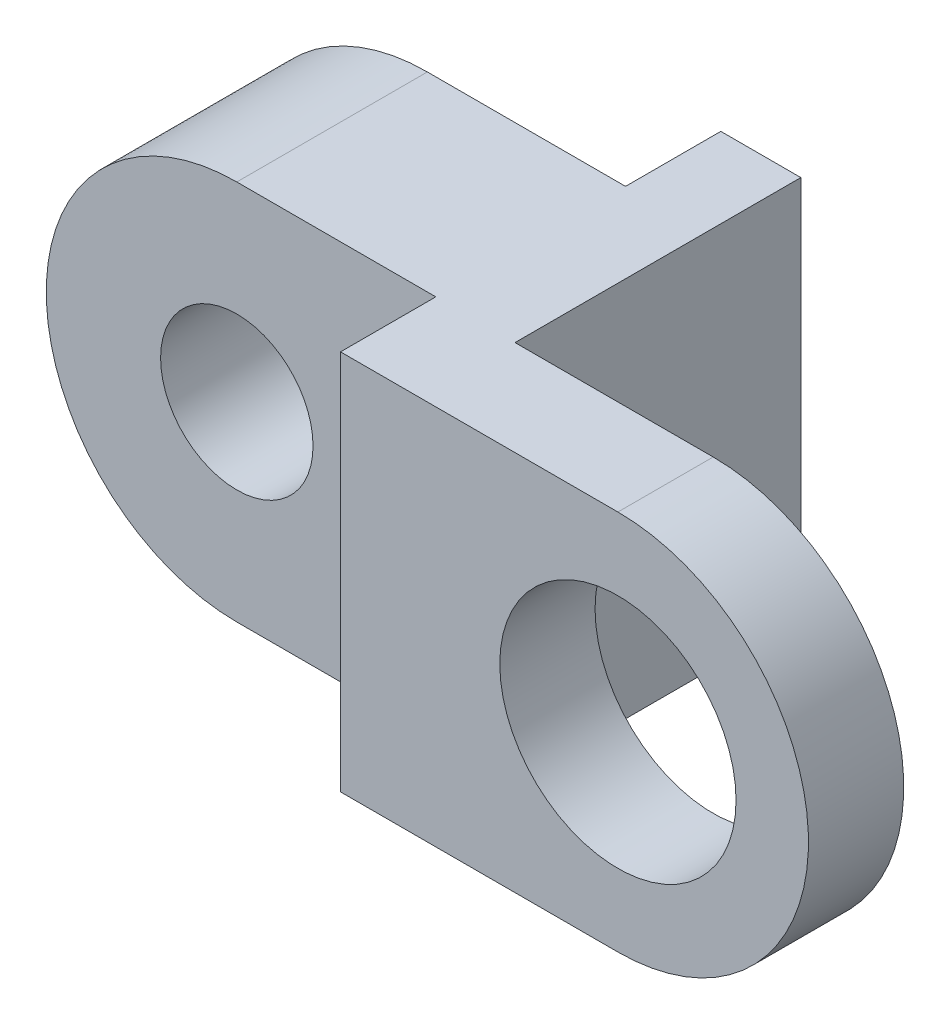
ISO-10303-21;
HEADER;
FILE_DESCRIPTION(('STEP AP214'),'2;1');
FILE_NAME('part.step','',(''),(''),'','','');
FILE_SCHEMA(('AUTOMOTIVE_DESIGN { 1 0 10303 214 1 1 1 1 }'));
ENDSEC;
DATA;
#1=APPLICATION_CONTEXT('core data for automotive mechanical design processes');
#2=APPLICATION_PROTOCOL_DEFINITION('international standard','automotive_design',2000,#1);
#3=PRODUCT_CONTEXT('',#1,'mechanical');
#4=PRODUCT('Part','Part','',(#3));
#5=PRODUCT_RELATED_PRODUCT_CATEGORY('part','',(#4));
#6=PRODUCT_DEFINITION_FORMATION('','',#4);
#7=PRODUCT_DEFINITION_CONTEXT('part definition',#1,'design');
#8=PRODUCT_DEFINITION('design','',#6,#7);
#9=PRODUCT_DEFINITION_SHAPE('','',#8);
#10=(LENGTH_UNIT() NAMED_UNIT(*) SI_UNIT(.MILLI.,.METRE.));
#11=(NAMED_UNIT(*) PLANE_ANGLE_UNIT() SI_UNIT($,.RADIAN.));
#12=(NAMED_UNIT(*) SI_UNIT($,.STERADIAN.) SOLID_ANGLE_UNIT());
#13=UNCERTAINTY_MEASURE_WITH_UNIT(LENGTH_MEASURE(1.E-05),#10,'distance_accuracy_value','');
#14=(GEOMETRIC_REPRESENTATION_CONTEXT(3) GLOBAL_UNCERTAINTY_ASSIGNED_CONTEXT((#13)) GLOBAL_UNIT_ASSIGNED_CONTEXT((#10,
#11,#12)) REPRESENTATION_CONTEXT('',''));
#15=CARTESIAN_POINT('',(0.,0.,0.));
#16=DIRECTION('',(0.,0.,1.));
#17=DIRECTION('',(1.,0.,0.));
#18=AXIS2_PLACEMENT_3D('',#15,#16,#17);
#19=CARTESIAN_POINT('',(6.25,0.,10.));
#20=DIRECTION('',(0.,0.,-1.));
#21=DIRECTION('',(-1.,0.,0.));
#22=AXIS2_PLACEMENT_3D('',#19,#20,#21);
#23=CYLINDRICAL_SURFACE('',#22,5.);
#24=CARTESIAN_POINT('',(6.25,0.,7.5));
#25=DIRECTION('',(0.,0.,1.));
#26=DIRECTION('',(1.,0.,0.));
#27=AXIS2_PLACEMENT_3D('',#24,#25,#26);
#28=CIRCLE('',#27,5.);
#29=CARTESIAN_POINT('',(6.25,-5.,7.5));
#30=VERTEX_POINT('',#29);
#31=CARTESIAN_POINT('',(6.25,5.,7.5));
#32=VERTEX_POINT('',#31);
#33=EDGE_CURVE('E179',#30,#32,#28,.T.);
#34=ORIENTED_EDGE('',*,*,#33,.T.);
#35=DIRECTION('',(0.,0.,-1.));
#36=VECTOR('',#35,1.);
#37=CARTESIAN_POINT('',(6.25,5.,10.));
#38=LINE('',#37,#36);
#39=CARTESIAN_POINT('',(6.25,5.,10.));
#40=VERTEX_POINT('',#39);
#41=EDGE_CURVE('E11',#40,#32,#38,.T.);
#42=ORIENTED_EDGE('',*,*,#41,.F.);
#43=CARTESIAN_POINT('',(6.25,0.,10.));
#44=DIRECTION('',(0.,0.,1.));
#45=DIRECTION('',(-1.,0.,0.));
#46=AXIS2_PLACEMENT_3D('',#43,#44,#45);
#47=CIRCLE('',#46,5.);
#48=CARTESIAN_POINT('',(6.25,-5.,10.));
#49=VERTEX_POINT('',#48);
#50=EDGE_CURVE('E182',#49,#40,#47,.T.);
#51=ORIENTED_EDGE('',*,*,#50,.F.);
#52=DIRECTION('',(0.,0.,-1.));
#53=VECTOR('',#52,1.);
#54=CARTESIAN_POINT('',(6.25,-5.,10.));
#55=LINE('',#54,#53);
#56=EDGE_CURVE('E190',#49,#30,#55,.T.);
#57=ORIENTED_EDGE('',*,*,#56,.T.);
#58=EDGE_LOOP('',(#34,#42,#51,#57));
#59=FACE_BOUND('',#58,.T.);
#60=ADVANCED_FACE('F43',(#59),#23,.T.);
#61=CARTESIAN_POINT('',(-6.25,5.,10.));
#62=DIRECTION('',(0.,-1.,0.));
#63=DIRECTION('',(0.,0.,-1.));
#64=AXIS2_PLACEMENT_3D('',#61,#62,#63);
#65=PLANE('',#64);
#66=DIRECTION('',(1.,0.,0.));
#67=VECTOR('',#66,1.);
#68=CARTESIAN_POINT('',(1.05,5.,7.5));
#69=LINE('',#68,#67);
#70=CARTESIAN_POINT('',(1.05,5.,7.5));
#71=VERTEX_POINT('',#70);
#72=EDGE_CURVE('E153',#71,#32,#69,.T.);
#73=ORIENTED_EDGE('',*,*,#72,.F.);
#74=DIRECTION('',(0.,0.,1.));
#75=VECTOR('',#74,1.);
#76=CARTESIAN_POINT('',(1.05,5.,7.5));
#77=LINE('',#76,#75);
#78=CARTESIAN_POINT('',(1.05,5.,0.));
#79=VERTEX_POINT('',#78);
#80=EDGE_CURVE('E130',#79,#71,#77,.T.);
#81=ORIENTED_EDGE('',*,*,#80,.F.);
#82=DIRECTION('',(-1.,0.,0.));
#83=VECTOR('',#82,1.);
#84=CARTESIAN_POINT('',(-6.25,5.,0.));
#85=LINE('',#84,#83);
#86=CARTESIAN_POINT('',(-1.05,5.,0.));
#87=VERTEX_POINT('',#86);
#88=EDGE_CURVE('E181',#79,#87,#85,.T.);
#89=ORIENTED_EDGE('',*,*,#88,.T.);
#90=DIRECTION('',(0.,0.,-1.));
#91=VECTOR('',#90,1.);
#92=CARTESIAN_POINT('',(-1.05,5.,0.));
#93=LINE('',#92,#91);
#94=CARTESIAN_POINT('',(-1.05,5.,2.5));
#95=VERTEX_POINT('',#94);
#96=EDGE_CURVE('E66',#95,#87,#93,.T.);
#97=ORIENTED_EDGE('',*,*,#96,.F.);
#98=DIRECTION('',(1.,0.,0.));
#99=VECTOR('',#98,1.);
#100=CARTESIAN_POINT('',(-11.25,5.,2.5));
#101=LINE('',#100,#99);
#102=CARTESIAN_POINT('',(-6.25,5.,2.5));
#103=VERTEX_POINT('',#102);
#104=EDGE_CURVE('E137',#103,#95,#101,.T.);
#105=ORIENTED_EDGE('',*,*,#104,.F.);
#106=DIRECTION('',(0.,0.,-1.));
#107=VECTOR('',#106,1.);
#108=CARTESIAN_POINT('',(-6.25,5.,10.));
#109=LINE('',#108,#107);
#110=CARTESIAN_POINT('',(-6.25,5.,7.5));
#111=VERTEX_POINT('',#110);
#112=EDGE_CURVE('E51',#111,#103,#109,.T.);
#113=ORIENTED_EDGE('',*,*,#112,.F.);
#114=DIRECTION('',(-1.,0.,0.));
#115=VECTOR('',#114,1.);
#116=CARTESIAN_POINT('',(-11.25,5.,7.5));
#117=LINE('',#116,#115);
#118=CARTESIAN_POINT('',(-1.0284269701657,5.,7.5));
#119=VERTEX_POINT('',#118);
#120=EDGE_CURVE('E125',#119,#111,#117,.T.);
#121=ORIENTED_EDGE('',*,*,#120,.F.);
#122=DIRECTION('',(0.,0.,-1.));
#123=VECTOR('',#122,1.);
#124=CARTESIAN_POINT('',(-1.0284269701657,5.,10.));
#125=LINE('',#124,#123);
#126=CARTESIAN_POINT('',(-1.0284269701657,5.,10.));
#127=VERTEX_POINT('',#126);
#128=EDGE_CURVE('E133',#127,#119,#125,.T.);
#129=ORIENTED_EDGE('',*,*,#128,.F.);
#130=DIRECTION('',(-1.,0.,0.));
#131=VECTOR('',#130,1.);
#132=CARTESIAN_POINT('',(-6.25,5.,10.));
#133=LINE('',#132,#131);
#134=EDGE_CURVE('E185',#40,#127,#133,.T.);
#135=ORIENTED_EDGE('',*,*,#134,.F.);
#136=ORIENTED_EDGE('',*,*,#41,.T.);
#137=EDGE_LOOP('',(#73,#81,#89,#97,#105,#113,#121,#129,#135,#136));
#138=FACE_BOUND('',#137,.T.);
#139=ADVANCED_FACE('F140',(#138),#65,.F.);
#140=CARTESIAN_POINT('',(-6.25,0.,10.));
#141=DIRECTION('',(0.,0.,-1.));
#142=DIRECTION('',(-1.,0.,0.));
#143=AXIS2_PLACEMENT_3D('',#140,#141,#142);
#144=CYLINDRICAL_SURFACE('',#143,5.);
#145=CARTESIAN_POINT('',(-6.25,0.,7.5));
#146=DIRECTION('',(0.,0.,-1.));
#147=DIRECTION('',(-1.,0.,0.));
#148=AXIS2_PLACEMENT_3D('',#145,#146,#147);
#149=CIRCLE('',#148,5.);
#150=CARTESIAN_POINT('',(-6.25,-5.,7.5));
#151=VERTEX_POINT('',#150);
#152=EDGE_CURVE('E177',#151,#111,#149,.T.);
#153=ORIENTED_EDGE('',*,*,#152,.T.);
#154=ORIENTED_EDGE('',*,*,#112,.T.);
#155=CARTESIAN_POINT('',(-6.25,0.,2.5));
#156=DIRECTION('',(0.,0.,1.));
#157=DIRECTION('',(1.,0.,0.));
#158=AXIS2_PLACEMENT_3D('',#155,#156,#157);
#159=CIRCLE('',#158,5.);
#160=CARTESIAN_POINT('',(-6.25,-5.,2.5));
#161=VERTEX_POINT('',#160);
#162=EDGE_CURVE('E174',#103,#161,#159,.T.);
#163=ORIENTED_EDGE('',*,*,#162,.T.);
#164=DIRECTION('',(0.,0.,-1.));
#165=VECTOR('',#164,1.);
#166=CARTESIAN_POINT('',(-6.25,-5.,10.));
#167=LINE('',#166,#165);
#168=EDGE_CURVE('E197',#151,#161,#167,.T.);
#169=ORIENTED_EDGE('',*,*,#168,.F.);
#170=EDGE_LOOP('',(#153,#154,#163,#169));
#171=FACE_BOUND('',#170,.T.);
#172=ADVANCED_FACE('F201',(#171),#144,.T.);
#173=CARTESIAN_POINT('',(-6.25,-5.,10.));
#174=DIRECTION('',(0.,1.,0.));
#175=DIRECTION('',(-1.,0.,0.));
#176=AXIS2_PLACEMENT_3D('',#173,#174,#175);
#177=PLANE('',#176);
#178=DIRECTION('',(1.,0.,0.));
#179=VECTOR('',#178,1.);
#180=CARTESIAN_POINT('',(-6.25,-5.,0.));
#181=LINE('',#180,#179);
#182=CARTESIAN_POINT('',(-1.05,-5.,0.));
#183=VERTEX_POINT('',#182);
#184=CARTESIAN_POINT('',(1.05,-5.,0.));
#185=VERTEX_POINT('',#184);
#186=EDGE_CURVE('E186',#183,#185,#181,.T.);
#187=ORIENTED_EDGE('',*,*,#186,.T.);
#188=DIRECTION('',(0.,0.,1.));
#189=VECTOR('',#188,1.);
#190=CARTESIAN_POINT('',(1.05,-5.,7.5));
#191=LINE('',#190,#189);
#192=CARTESIAN_POINT('',(1.05,-5.,7.5));
#193=VERTEX_POINT('',#192);
#194=EDGE_CURVE('E156',#185,#193,#191,.T.);
#195=ORIENTED_EDGE('',*,*,#194,.T.);
#196=DIRECTION('',(1.,0.,0.));
#197=VECTOR('',#196,1.);
#198=CARTESIAN_POINT('',(1.05,-5.,7.5));
#199=LINE('',#198,#197);
#200=EDGE_CURVE('E150',#193,#30,#199,.T.);
#201=ORIENTED_EDGE('',*,*,#200,.T.);
#202=ORIENTED_EDGE('',*,*,#56,.F.);
#203=DIRECTION('',(1.,0.,0.));
#204=VECTOR('',#203,1.);
#205=CARTESIAN_POINT('',(-6.25,-5.,10.));
#206=LINE('',#205,#204);
#207=CARTESIAN_POINT('',(-1.0284269701657,-5.,10.));
#208=VERTEX_POINT('',#207);
#209=EDGE_CURVE('E188',#208,#49,#206,.T.);
#210=ORIENTED_EDGE('',*,*,#209,.F.);
#211=DIRECTION('',(0.,0.,-1.));
#212=VECTOR('',#211,1.);
#213=CARTESIAN_POINT('',(-1.0284269701657,-5.,10.));
#214=LINE('',#213,#212);
#215=CARTESIAN_POINT('',(-1.0284269701657,-5.,7.5));
#216=VERTEX_POINT('',#215);
#217=EDGE_CURVE('E58',#208,#216,#214,.T.);
#218=ORIENTED_EDGE('',*,*,#217,.T.);
#219=DIRECTION('',(-1.,0.,0.));
#220=VECTOR('',#219,1.);
#221=CARTESIAN_POINT('',(-11.25,-5.,7.5));
#222=LINE('',#221,#220);
#223=EDGE_CURVE('E128',#216,#151,#222,.T.);
#224=ORIENTED_EDGE('',*,*,#223,.T.);
#225=ORIENTED_EDGE('',*,*,#168,.T.);
#226=DIRECTION('',(1.,0.,0.));
#227=VECTOR('',#226,1.);
#228=CARTESIAN_POINT('',(-11.25,-5.,2.5));
#229=LINE('',#228,#227);
#230=CARTESIAN_POINT('',(-1.05,-5.,2.5));
#231=VERTEX_POINT('',#230);
#232=EDGE_CURVE('E163',#161,#231,#229,.T.);
#233=ORIENTED_EDGE('',*,*,#232,.T.);
#234=DIRECTION('',(0.,0.,-1.));
#235=VECTOR('',#234,1.);
#236=CARTESIAN_POINT('',(-1.05,-5.,0.));
#237=LINE('',#236,#235);
#238=EDGE_CURVE('E166',#231,#183,#237,.T.);
#239=ORIENTED_EDGE('',*,*,#238,.T.);
#240=EDGE_LOOP('',(#187,#195,#201,#202,#210,#218,#224,#225,#233,#239));
#241=FACE_BOUND('',#240,.T.);
#242=ADVANCED_FACE('F205',(#241),#177,.F.);
#243=CARTESIAN_POINT('',(6.25,0.,10.));
#244=DIRECTION('',(0.,0.,-1.));
#245=DIRECTION('',(-1.,0.,0.));
#246=AXIS2_PLACEMENT_3D('',#243,#244,#245);
#247=PLANE('',#246);
#248=CARTESIAN_POINT('',(6.25,0.,10.));
#249=DIRECTION('',(0.,0.,1.));
#250=DIRECTION('',(1.,0.,0.));
#251=AXIS2_PLACEMENT_3D('',#248,#249,#250);
#252=CIRCLE('',#251,3.10000000000001);
#253=CARTESIAN_POINT('',(9.35000000000001,0.,10.));
#254=VERTEX_POINT('',#253);
#255=EDGE_CURVE('E219',#254,#254,#252,.T.);
#256=ORIENTED_EDGE('',*,*,#255,.F.);
#257=EDGE_LOOP('',(#256));
#258=FACE_BOUND('',#257,.T.);
#259=ORIENTED_EDGE('',*,*,#134,.T.);
#260=DIRECTION('',(0.,1.,0.));
#261=VECTOR('',#260,1.);
#262=CARTESIAN_POINT('',(-1.0284269701657,-5.,10.));
#263=LINE('',#262,#261);
#264=EDGE_CURVE('E129',#208,#127,#263,.T.);
#265=ORIENTED_EDGE('',*,*,#264,.F.);
#266=ORIENTED_EDGE('',*,*,#209,.T.);
#267=ORIENTED_EDGE('',*,*,#50,.T.);
#268=EDGE_LOOP('',(#259,#265,#266,#267));
#269=FACE_BOUND('',#268,.T.);
#270=ADVANCED_FACE('F210',(#258,#269),#247,.F.);
#271=CARTESIAN_POINT('',(6.25,0.,0.));
#272=DIRECTION('',(0.,0.,-1.));
#273=DIRECTION('',(-1.,0.,0.));
#274=AXIS2_PLACEMENT_3D('',#271,#272,#273);
#275=PLANE('',#274);
#276=DIRECTION('',(0.,1.,0.));
#277=VECTOR('',#276,1.);
#278=CARTESIAN_POINT('',(1.05,-5.,0.));
#279=LINE('',#278,#277);
#280=EDGE_CURVE('E151',#185,#79,#279,.T.);
#281=ORIENTED_EDGE('',*,*,#280,.F.);
#282=ORIENTED_EDGE('',*,*,#186,.F.);
#283=DIRECTION('',(0.,1.,0.));
#284=VECTOR('',#283,1.);
#285=CARTESIAN_POINT('',(-1.05,-5.,0.));
#286=LINE('',#285,#284);
#287=EDGE_CURVE('E172',#183,#87,#286,.T.);
#288=ORIENTED_EDGE('',*,*,#287,.T.);
#289=ORIENTED_EDGE('',*,*,#88,.F.);
#290=EDGE_LOOP('',(#281,#282,#288,#289));
#291=FACE_BOUND('',#290,.T.);
#292=ADVANCED_FACE('F227',(#291),#275,.T.);
#293=CARTESIAN_POINT('',(-11.25,-5.,2.5));
#294=DIRECTION('',(0.,0.,1.));
#295=DIRECTION('',(1.,0.,0.));
#296=AXIS2_PLACEMENT_3D('',#293,#294,#295);
#297=PLANE('',#296);
#298=CARTESIAN_POINT('',(-6.25,0.,2.5));
#299=DIRECTION('',(0.,0.,1.));
#300=DIRECTION('',(1.,0.,0.));
#301=AXIS2_PLACEMENT_3D('',#298,#299,#300);
#302=CIRCLE('',#301,2.);
#303=CARTESIAN_POINT('',(-4.25,0.,2.5));
#304=VERTEX_POINT('',#303);
#305=EDGE_CURVE('E213',#304,#304,#302,.T.);
#306=ORIENTED_EDGE('',*,*,#305,.T.);
#307=EDGE_LOOP('',(#306));
#308=FACE_BOUND('',#307,.T.);
#309=ORIENTED_EDGE('',*,*,#104,.T.);
#310=DIRECTION('',(0.,1.,0.));
#311=VECTOR('',#310,1.);
#312=CARTESIAN_POINT('',(-1.05,-5.,2.5));
#313=LINE('',#312,#311);
#314=EDGE_CURVE('E169',#231,#95,#313,.T.);
#315=ORIENTED_EDGE('',*,*,#314,.F.);
#316=ORIENTED_EDGE('',*,*,#232,.F.);
#317=ORIENTED_EDGE('',*,*,#162,.F.);
#318=EDGE_LOOP('',(#309,#315,#316,#317));
#319=FACE_BOUND('',#318,.T.);
#320=ADVANCED_FACE('F233',(#308,#319),#297,.F.);
#321=CARTESIAN_POINT('',(-1.05,-5.,0.));
#322=DIRECTION('',(1.,0.,0.));
#323=DIRECTION('',(0.,0.,-1.));
#324=AXIS2_PLACEMENT_3D('',#321,#322,#323);
#325=PLANE('',#324);
#326=ORIENTED_EDGE('',*,*,#96,.T.);
#327=ORIENTED_EDGE('',*,*,#287,.F.);
#328=ORIENTED_EDGE('',*,*,#238,.F.);
#329=ORIENTED_EDGE('',*,*,#314,.T.);
#330=EDGE_LOOP('',(#326,#327,#328,#329));
#331=FACE_BOUND('',#330,.T.);
#332=ADVANCED_FACE('F252',(#331),#325,.F.);
#333=CARTESIAN_POINT('',(1.05,-5.,7.5));
#334=DIRECTION('',(0.,0.,1.));
#335=DIRECTION('',(1.,0.,0.));
#336=AXIS2_PLACEMENT_3D('',#333,#334,#335);
#337=PLANE('',#336);
#338=CARTESIAN_POINT('',(6.25,0.,7.5));
#339=DIRECTION('',(0.,0.,1.));
#340=DIRECTION('',(1.,0.,0.));
#341=AXIS2_PLACEMENT_3D('',#338,#339,#340);
#342=CIRCLE('',#341,3.10000000000001);
#343=CARTESIAN_POINT('',(9.35000000000001,0.,7.5));
#344=VERTEX_POINT('',#343);
#345=EDGE_CURVE('E46',#344,#344,#342,.T.);
#346=ORIENTED_EDGE('',*,*,#345,.T.);
#347=EDGE_LOOP('',(#346));
#348=FACE_BOUND('',#347,.T.);
#349=ORIENTED_EDGE('',*,*,#33,.F.);
#350=ORIENTED_EDGE('',*,*,#200,.F.);
#351=DIRECTION('',(0.,1.,0.));
#352=VECTOR('',#351,1.);
#353=CARTESIAN_POINT('',(1.05,-5.,7.5));
#354=LINE('',#353,#352);
#355=EDGE_CURVE('E148',#193,#71,#354,.T.);
#356=ORIENTED_EDGE('',*,*,#355,.T.);
#357=ORIENTED_EDGE('',*,*,#72,.T.);
#358=EDGE_LOOP('',(#349,#350,#356,#357));
#359=FACE_BOUND('',#358,.T.);
#360=ADVANCED_FACE('F245',(#348,#359),#337,.F.);
#361=CARTESIAN_POINT('',(1.05,-5.,7.5));
#362=DIRECTION('',(-1.,0.,0.));
#363=DIRECTION('',(0.,0.,1.));
#364=AXIS2_PLACEMENT_3D('',#361,#362,#363);
#365=PLANE('',#364);
#366=ORIENTED_EDGE('',*,*,#80,.T.);
#367=ORIENTED_EDGE('',*,*,#355,.F.);
#368=ORIENTED_EDGE('',*,*,#194,.F.);
#369=ORIENTED_EDGE('',*,*,#280,.T.);
#370=EDGE_LOOP('',(#366,#367,#368,#369));
#371=FACE_BOUND('',#370,.T.);
#372=ADVANCED_FACE('F263',(#371),#365,.F.);
#373=CARTESIAN_POINT('',(-11.25,-5.,7.5));
#374=DIRECTION('',(0.,0.,-1.));
#375=DIRECTION('',(-1.,0.,0.));
#376=AXIS2_PLACEMENT_3D('',#373,#374,#375);
#377=PLANE('',#376);
#378=CARTESIAN_POINT('',(-6.25,0.,7.5));
#379=DIRECTION('',(0.,0.,-1.));
#380=DIRECTION('',(-1.,0.,0.));
#381=AXIS2_PLACEMENT_3D('',#378,#379,#380);
#382=CIRCLE('',#381,2.);
#383=CARTESIAN_POINT('',(-8.25,0.,7.5));
#384=VERTEX_POINT('',#383);
#385=EDGE_CURVE('E216',#384,#384,#382,.T.);
#386=ORIENTED_EDGE('',*,*,#385,.T.);
#387=EDGE_LOOP('',(#386));
#388=FACE_BOUND('',#387,.T.);
#389=ORIENTED_EDGE('',*,*,#152,.F.);
#390=ORIENTED_EDGE('',*,*,#223,.F.);
#391=DIRECTION('',(0.,1.,0.));
#392=VECTOR('',#391,1.);
#393=CARTESIAN_POINT('',(-1.0284269701657,-5.,7.5));
#394=LINE('',#393,#392);
#395=EDGE_CURVE('E121',#216,#119,#394,.T.);
#396=ORIENTED_EDGE('',*,*,#395,.T.);
#397=ORIENTED_EDGE('',*,*,#120,.T.);
#398=EDGE_LOOP('',(#389,#390,#396,#397));
#399=FACE_BOUND('',#398,.T.);
#400=ADVANCED_FACE('F123',(#388,#399),#377,.F.);
#401=CARTESIAN_POINT('',(-1.0284269701657,-5.,10.));
#402=DIRECTION('',(1.,0.,0.));
#403=DIRECTION('',(0.,0.,-1.));
#404=AXIS2_PLACEMENT_3D('',#401,#402,#403);
#405=PLANE('',#404);
#406=ORIENTED_EDGE('',*,*,#128,.T.);
#407=ORIENTED_EDGE('',*,*,#395,.F.);
#408=ORIENTED_EDGE('',*,*,#217,.F.);
#409=ORIENTED_EDGE('',*,*,#264,.T.);
#410=EDGE_LOOP('',(#406,#407,#408,#409));
#411=FACE_BOUND('',#410,.T.);
#412=ADVANCED_FACE('F134',(#411),#405,.F.);
#413=CARTESIAN_POINT('',(-6.25,0.,0.));
#414=DIRECTION('',(0.,0.,1.));
#415=DIRECTION('',(1.,0.,0.));
#416=AXIS2_PLACEMENT_3D('',#413,#414,#415);
#417=CYLINDRICAL_SURFACE('',#416,2.);
#418=ORIENTED_EDGE('',*,*,#385,.F.);
#419=EDGE_LOOP('',(#418));
#420=FACE_BOUND('',#419,.T.);
#421=ORIENTED_EDGE('',*,*,#305,.F.);
#422=EDGE_LOOP('',(#421));
#423=FACE_BOUND('',#422,.T.);
#424=ADVANCED_FACE('F272',(#420,#423),#417,.F.);
#425=CARTESIAN_POINT('',(6.25,0.,0.));
#426=DIRECTION('',(0.,0.,1.));
#427=DIRECTION('',(1.,0.,0.));
#428=AXIS2_PLACEMENT_3D('',#425,#426,#427);
#429=CYLINDRICAL_SURFACE('',#428,3.10000000000001);
#430=ORIENTED_EDGE('',*,*,#255,.T.);
#431=EDGE_LOOP('',(#430));
#432=FACE_BOUND('',#431,.T.);
#433=ORIENTED_EDGE('',*,*,#345,.F.);
#434=EDGE_LOOP('',(#433));
#435=FACE_BOUND('',#434,.T.);
#436=ADVANCED_FACE('F223',(#432,#435),#429,.F.);
#437=CLOSED_SHELL('',(#60,#139,#172,#242,#270,#292,#320,#332,#360,#372,#400,#412,#424,#436));
#438=MANIFOLD_SOLID_BREP('B2',#437);
#439=ADVANCED_BREP_SHAPE_REPRESENTATION('',(#18,#438),#14);
#440=SHAPE_DEFINITION_REPRESENTATION(#9,#439);
ENDSEC;
END-ISO-10303-21;
